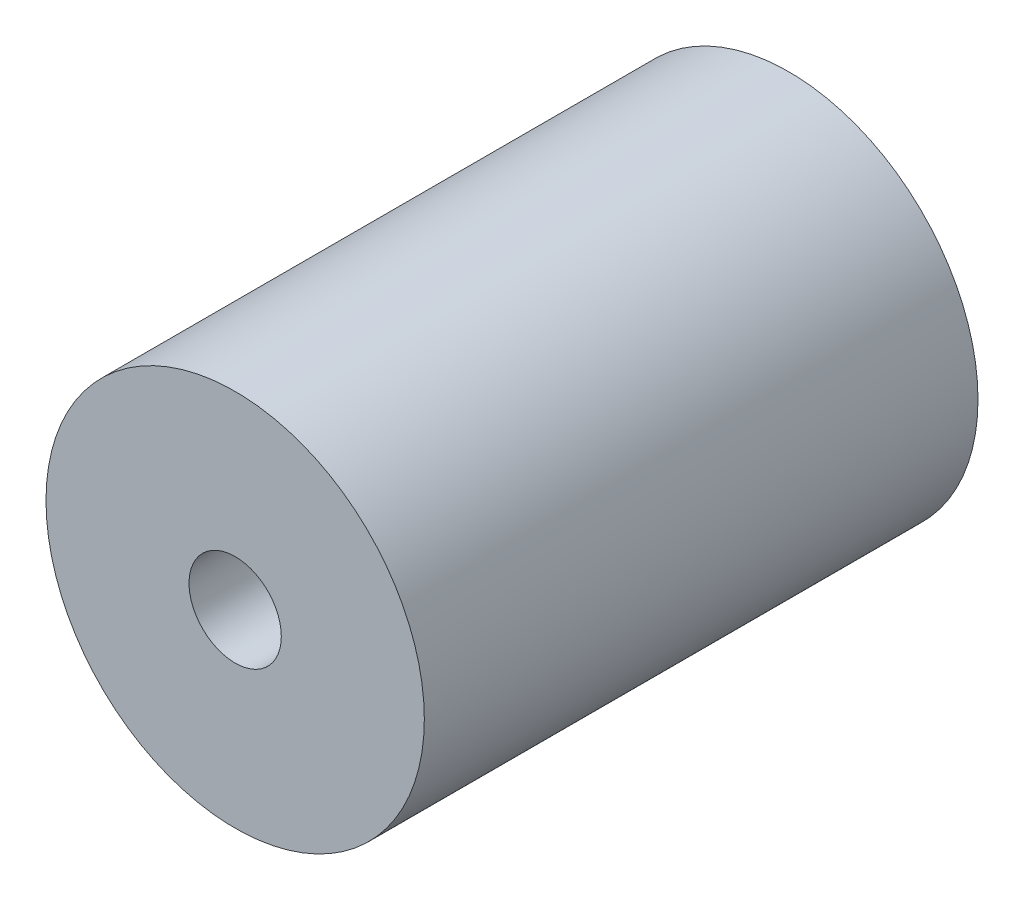
ISO-10303-21;
HEADER;
FILE_DESCRIPTION(('STEP AP214'),'2;1');
FILE_NAME('part.step','',(''),(''),'','','');
FILE_SCHEMA(('AUTOMOTIVE_DESIGN { 1 0 10303 214 1 1 1 1 }'));
ENDSEC;
DATA;
#1=APPLICATION_CONTEXT('core data for automotive mechanical design processes');
#2=APPLICATION_PROTOCOL_DEFINITION('international standard','automotive_design',2000,#1);
#3=PRODUCT_CONTEXT('',#1,'mechanical');
#4=PRODUCT('Part','Part','',(#3));
#5=PRODUCT_RELATED_PRODUCT_CATEGORY('part','',(#4));
#6=PRODUCT_DEFINITION_FORMATION('','',#4);
#7=PRODUCT_DEFINITION_CONTEXT('part definition',#1,'design');
#8=PRODUCT_DEFINITION('design','',#6,#7);
#9=PRODUCT_DEFINITION_SHAPE('','',#8);
#10=(LENGTH_UNIT() NAMED_UNIT(*) SI_UNIT(.MILLI.,.METRE.));
#11=(NAMED_UNIT(*) PLANE_ANGLE_UNIT() SI_UNIT($,.RADIAN.));
#12=(NAMED_UNIT(*) SI_UNIT($,.STERADIAN.) SOLID_ANGLE_UNIT());
#13=UNCERTAINTY_MEASURE_WITH_UNIT(LENGTH_MEASURE(1.E-05),#10,'distance_accuracy_value','');
#14=(GEOMETRIC_REPRESENTATION_CONTEXT(3) GLOBAL_UNCERTAINTY_ASSIGNED_CONTEXT((#13)) GLOBAL_UNIT_ASSIGNED_CONTEXT((#10,
#11,#12)) REPRESENTATION_CONTEXT('',''));
#15=CARTESIAN_POINT('',(0.,0.,0.));
#16=DIRECTION('',(0.,0.,1.));
#17=DIRECTION('',(1.,0.,0.));
#18=AXIS2_PLACEMENT_3D('',#15,#16,#17);
#19=CARTESIAN_POINT('',(0.,0.,0.));
#20=DIRECTION('',(0.,0.,1.));
#21=DIRECTION('',(1.,0.,0.));
#22=AXIS2_PLACEMENT_3D('',#19,#20,#21);
#23=PLANE('',#22);
#24=CARTESIAN_POINT('',(0.,0.,0.));
#25=DIRECTION('',(0.,0.,1.));
#26=DIRECTION('',(1.,0.,0.));
#27=AXIS2_PLACEMENT_3D('',#24,#25,#26);
#28=CIRCLE('',#27,2.5);
#29=CARTESIAN_POINT('',(2.5,0.,0.));
#30=VERTEX_POINT('',#29);
#31=EDGE_CURVE('E50',#30,#30,#28,.T.);
#32=ORIENTED_EDGE('',*,*,#31,.T.);
#33=EDGE_LOOP('',(#32));
#34=FACE_BOUND('',#33,.T.);
#35=CARTESIAN_POINT('',(0.,0.,0.));
#36=DIRECTION('',(0.,0.,-1.));
#37=DIRECTION('',(-1.,0.,0.));
#38=AXIS2_PLACEMENT_3D('',#35,#36,#37);
#39=CIRCLE('',#38,4.);
#40=CARTESIAN_POINT('',(-4.,0.,0.));
#41=VERTEX_POINT('',#40);
#42=EDGE_CURVE('E62',#41,#41,#39,.T.);
#43=ORIENTED_EDGE('',*,*,#42,.T.);
#44=EDGE_LOOP('',(#43));
#45=FACE_BOUND('',#44,.T.);
#46=ADVANCED_FACE('F37',(#34,#45),#23,.F.);
#47=CARTESIAN_POINT('',(0.,0.,15.));
#48=DIRECTION('',(0.,0.,1.));
#49=DIRECTION('',(1.,0.,0.));
#50=AXIS2_PLACEMENT_3D('',#47,#48,#49);
#51=PLANE('',#50);
#52=CARTESIAN_POINT('',(0.,0.,15.));
#53=DIRECTION('',(0.,0.,1.));
#54=DIRECTION('',(1.,0.,0.));
#55=AXIS2_PLACEMENT_3D('',#52,#53,#54);
#56=CIRCLE('',#55,10.25);
#57=CARTESIAN_POINT('',(10.25,0.,15.));
#58=VERTEX_POINT('',#57);
#59=EDGE_CURVE('E10',#58,#58,#56,.T.);
#60=ORIENTED_EDGE('',*,*,#59,.T.);
#61=EDGE_LOOP('',(#60));
#62=FACE_BOUND('',#61,.T.);
#63=CARTESIAN_POINT('',(0.,0.,15.));
#64=DIRECTION('',(0.,0.,1.));
#65=DIRECTION('',(1.,0.,0.));
#66=AXIS2_PLACEMENT_3D('',#63,#64,#65);
#67=CIRCLE('',#66,2.5);
#68=CARTESIAN_POINT('',(2.5,0.,15.));
#69=VERTEX_POINT('',#68);
#70=EDGE_CURVE('E45',#69,#69,#67,.T.);
#71=ORIENTED_EDGE('',*,*,#70,.F.);
#72=EDGE_LOOP('',(#71));
#73=FACE_BOUND('',#72,.T.);
#74=ADVANCED_FACE('F85',(#62,#73),#51,.T.);
#75=CARTESIAN_POINT('',(0.,0.,15.));
#76=DIRECTION('',(0.,0.,-1.));
#77=DIRECTION('',(-1.,0.,0.));
#78=AXIS2_PLACEMENT_3D('',#75,#76,#77);
#79=CYLINDRICAL_SURFACE('',#78,10.25);
#80=ORIENTED_EDGE('',*,*,#59,.F.);
#81=EDGE_LOOP('',(#80));
#82=FACE_BOUND('',#81,.T.);
#83=CARTESIAN_POINT('',(0.,0.,-15.));
#84=DIRECTION('',(0.,0.,-1.));
#85=DIRECTION('',(-1.,0.,0.));
#86=AXIS2_PLACEMENT_3D('',#83,#84,#85);
#87=CIRCLE('',#86,10.25);
#88=CARTESIAN_POINT('',(-10.25,0.,-15.));
#89=VERTEX_POINT('',#88);
#90=EDGE_CURVE('E56',#89,#89,#87,.T.);
#91=ORIENTED_EDGE('',*,*,#90,.F.);
#92=EDGE_LOOP('',(#91));
#93=FACE_BOUND('',#92,.T.);
#94=ADVANCED_FACE('F39',(#82,#93),#79,.T.);
#95=CARTESIAN_POINT('',(0.,0.,15.));
#96=DIRECTION('',(0.,0.,-1.));
#97=DIRECTION('',(-1.,0.,0.));
#98=AXIS2_PLACEMENT_3D('',#95,#96,#97);
#99=CYLINDRICAL_SURFACE('',#98,2.5);
#100=ORIENTED_EDGE('',*,*,#70,.T.);
#101=EDGE_LOOP('',(#100));
#102=FACE_BOUND('',#101,.T.);
#103=ORIENTED_EDGE('',*,*,#31,.F.);
#104=EDGE_LOOP('',(#103));
#105=FACE_BOUND('',#104,.T.);
#106=ADVANCED_FACE('F75',(#102,#105),#99,.F.);
#107=CARTESIAN_POINT('',(0.,0.,-15.));
#108=DIRECTION('',(0.,0.,-1.));
#109=DIRECTION('',(-1.,0.,0.));
#110=AXIS2_PLACEMENT_3D('',#107,#108,#109);
#111=PLANE('',#110);
#112=ORIENTED_EDGE('',*,*,#90,.T.);
#113=EDGE_LOOP('',(#112));
#114=FACE_BOUND('',#113,.T.);
#115=CARTESIAN_POINT('',(0.,0.,-15.));
#116=DIRECTION('',(0.,0.,-1.));
#117=DIRECTION('',(-1.,0.,0.));
#118=AXIS2_PLACEMENT_3D('',#115,#116,#117);
#119=CIRCLE('',#118,4.);
#120=CARTESIAN_POINT('',(-4.,0.,-15.));
#121=VERTEX_POINT('',#120);
#122=EDGE_CURVE('E61',#121,#121,#119,.T.);
#123=ORIENTED_EDGE('',*,*,#122,.F.);
#124=EDGE_LOOP('',(#123));
#125=FACE_BOUND('',#124,.T.);
#126=ADVANCED_FACE('F73',(#114,#125),#111,.T.);
#127=CARTESIAN_POINT('',(0.,0.,-15.));
#128=DIRECTION('',(0.,0.,1.));
#129=DIRECTION('',(1.,0.,0.));
#130=AXIS2_PLACEMENT_3D('',#127,#128,#129);
#131=CYLINDRICAL_SURFACE('',#130,4.);
#132=ORIENTED_EDGE('',*,*,#122,.T.);
#133=EDGE_LOOP('',(#132));
#134=FACE_BOUND('',#133,.T.);
#135=ORIENTED_EDGE('',*,*,#42,.F.);
#136=EDGE_LOOP('',(#135));
#137=FACE_BOUND('',#136,.T.);
#138=ADVANCED_FACE('F70',(#134,#137),#131,.F.);
#139=CLOSED_SHELL('',(#46,#74,#94,#106,#126,#138));
#140=MANIFOLD_SOLID_BREP('B2',#139);
#141=ADVANCED_BREP_SHAPE_REPRESENTATION('',(#18,#140),#14);
#142=SHAPE_DEFINITION_REPRESENTATION(#9,#141);
ENDSEC;
END-ISO-10303-21;
